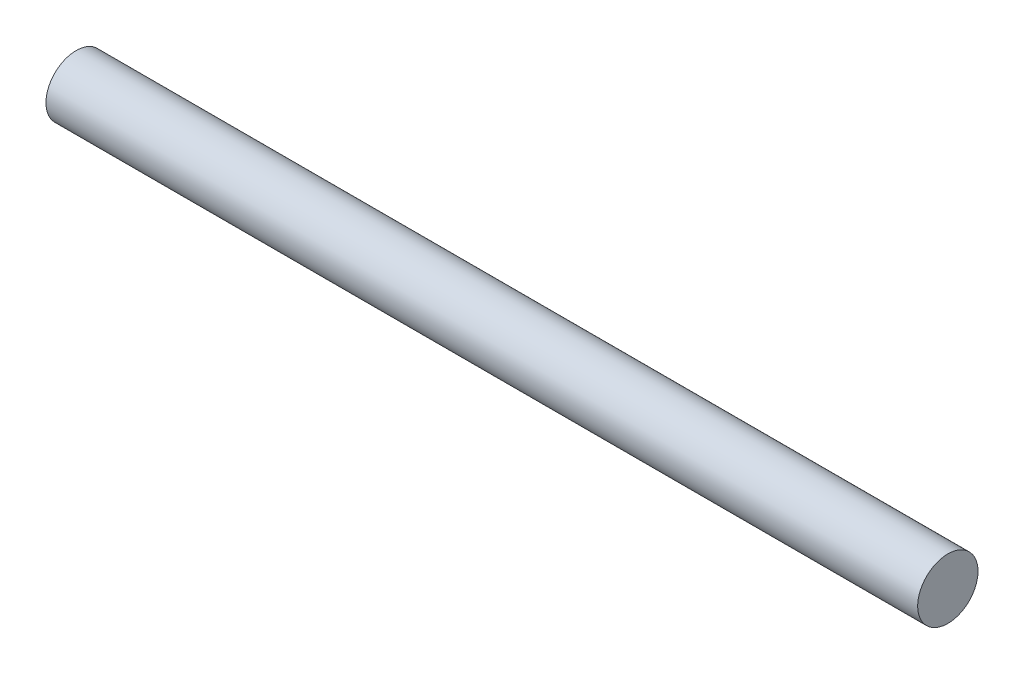
ISO-10303-21;
HEADER;
FILE_DESCRIPTION(('STEP AP214'),'2;1');
FILE_NAME('part.step','',(''),(''),'','','');
FILE_SCHEMA(('AUTOMOTIVE_DESIGN { 1 0 10303 214 1 1 1 1 }'));
ENDSEC;
DATA;
#1=APPLICATION_CONTEXT('core data for automotive mechanical design processes');
#2=APPLICATION_PROTOCOL_DEFINITION('international standard','automotive_design',2000,#1);
#3=PRODUCT_CONTEXT('',#1,'mechanical');
#4=PRODUCT('Part','Part','',(#3));
#5=PRODUCT_RELATED_PRODUCT_CATEGORY('part','',(#4));
#6=PRODUCT_DEFINITION_FORMATION('','',#4);
#7=PRODUCT_DEFINITION_CONTEXT('part definition',#1,'design');
#8=PRODUCT_DEFINITION('design','',#6,#7);
#9=PRODUCT_DEFINITION_SHAPE('','',#8);
#10=(LENGTH_UNIT() NAMED_UNIT(*) SI_UNIT(.MILLI.,.METRE.));
#11=(NAMED_UNIT(*) PLANE_ANGLE_UNIT() SI_UNIT($,.RADIAN.));
#12=(NAMED_UNIT(*) SI_UNIT($,.STERADIAN.) SOLID_ANGLE_UNIT());
#13=UNCERTAINTY_MEASURE_WITH_UNIT(LENGTH_MEASURE(1.E-05),#10,'distance_accuracy_value','');
#14=(GEOMETRIC_REPRESENTATION_CONTEXT(3) GLOBAL_UNCERTAINTY_ASSIGNED_CONTEXT((#13)) GLOBAL_UNIT_ASSIGNED_CONTEXT((#10,
#11,#12)) REPRESENTATION_CONTEXT('',''));
#15=CARTESIAN_POINT('',(0.,0.,0.));
#16=DIRECTION('',(0.,0.,1.));
#17=DIRECTION('',(1.,0.,0.));
#18=AXIS2_PLACEMENT_3D('',#15,#16,#17);
#19=CARTESIAN_POINT('',(582.5680119,0.,0.));
#20=DIRECTION('',(-1.,0.,0.));
#21=DIRECTION('',(0.,0.,1.));
#22=AXIS2_PLACEMENT_3D('',#19,#20,#21);
#23=CYLINDRICAL_SURFACE('',#22,14.90218);
#24=CARTESIAN_POINT('',(582.5680119,0.,0.));
#25=DIRECTION('',(1.,0.,0.));
#26=DIRECTION('',(0.,0.,-1.));
#27=AXIS2_PLACEMENT_3D('',#24,#25,#26);
#28=CIRCLE('',#27,14.90218);
#29=CARTESIAN_POINT('',(582.5680119,0.,-14.90218));
#30=VERTEX_POINT('',#29);
#31=EDGE_CURVE('E10',#30,#30,#28,.T.);
#32=ORIENTED_EDGE('',*,*,#31,.F.);
#33=EDGE_LOOP('',(#32));
#34=FACE_BOUND('',#33,.T.);
#35=CARTESIAN_POINT('',(151.7459881,0.,0.));
#36=DIRECTION('',(1.,0.,0.));
#37=DIRECTION('',(0.,0.,-1.));
#38=AXIS2_PLACEMENT_3D('',#35,#36,#37);
#39=CIRCLE('',#38,14.90218);
#40=CARTESIAN_POINT('',(151.7459881,0.,-14.90218));
#41=VERTEX_POINT('',#40);
#42=EDGE_CURVE('E35',#41,#41,#39,.T.);
#43=ORIENTED_EDGE('',*,*,#42,.T.);
#44=EDGE_LOOP('',(#43));
#45=FACE_BOUND('',#44,.T.);
#46=ADVANCED_FACE('F32',(#34,#45),#23,.T.);
#47=CARTESIAN_POINT('',(582.5680119,0.,0.));
#48=DIRECTION('',(1.,0.,0.));
#49=DIRECTION('',(0.,0.,-1.));
#50=AXIS2_PLACEMENT_3D('',#47,#48,#49);
#51=PLANE('',#50);
#52=ORIENTED_EDGE('',*,*,#31,.T.);
#53=EDGE_LOOP('',(#52));
#54=FACE_BOUND('',#53,.T.);
#55=ADVANCED_FACE('F47',(#54),#51,.T.);
#56=CARTESIAN_POINT('',(151.7459881,0.,0.));
#57=DIRECTION('',(1.,0.,0.));
#58=DIRECTION('',(0.,0.,-1.));
#59=AXIS2_PLACEMENT_3D('',#56,#57,#58);
#60=PLANE('',#59);
#61=ORIENTED_EDGE('',*,*,#42,.F.);
#62=EDGE_LOOP('',(#61));
#63=FACE_BOUND('',#62,.T.);
#64=ADVANCED_FACE('F45',(#63),#60,.F.);
#65=CLOSED_SHELL('',(#46,#55,#64));
#66=MANIFOLD_SOLID_BREP('B2',#65);
#67=ADVANCED_BREP_SHAPE_REPRESENTATION('',(#18,#66),#14);
#68=SHAPE_DEFINITION_REPRESENTATION(#9,#67);
ENDSEC;
END-ISO-10303-21;
